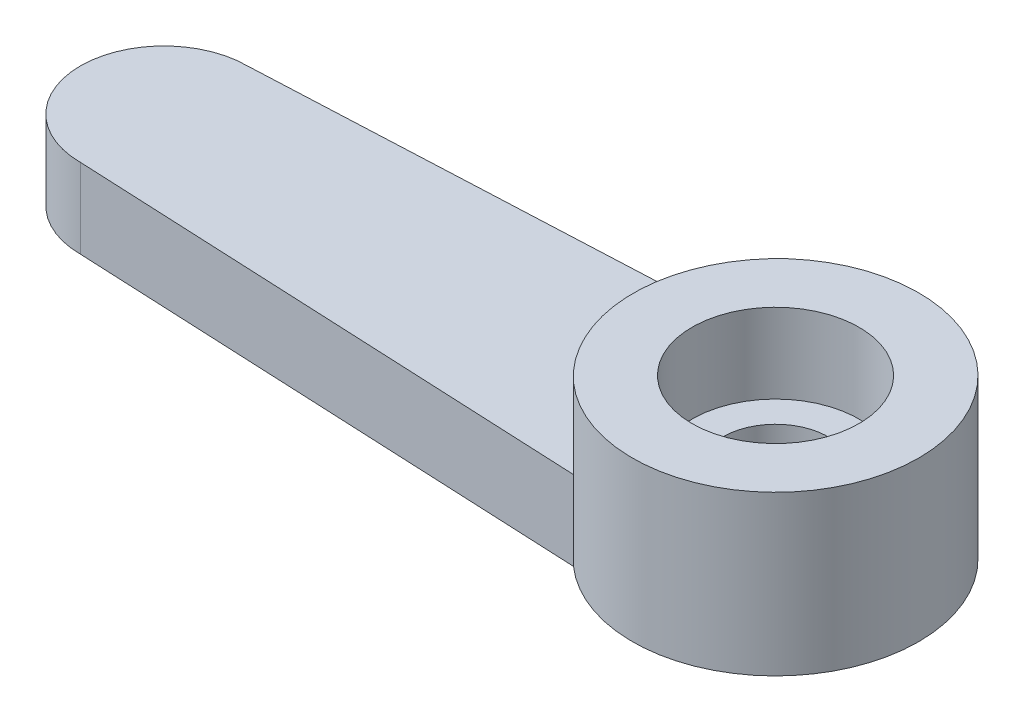
ISO-10303-21;
HEADER;
FILE_DESCRIPTION(('STEP AP214'),'2;1');
FILE_NAME('part.step','',(''),(''),'','','');
FILE_SCHEMA(('AUTOMOTIVE_DESIGN { 1 0 10303 214 1 1 1 1 }'));
ENDSEC;
DATA;
#1=APPLICATION_CONTEXT('core data for automotive mechanical design processes');
#2=APPLICATION_PROTOCOL_DEFINITION('international standard','automotive_design',2000,#1);
#3=PRODUCT_CONTEXT('',#1,'mechanical');
#4=PRODUCT('Part','Part','',(#3));
#5=PRODUCT_RELATED_PRODUCT_CATEGORY('part','',(#4));
#6=PRODUCT_DEFINITION_FORMATION('','',#4);
#7=PRODUCT_DEFINITION_CONTEXT('part definition',#1,'design');
#8=PRODUCT_DEFINITION('design','',#6,#7);
#9=PRODUCT_DEFINITION_SHAPE('','',#8);
#10=(LENGTH_UNIT() NAMED_UNIT(*) SI_UNIT(.MILLI.,.METRE.));
#11=(NAMED_UNIT(*) PLANE_ANGLE_UNIT() SI_UNIT($,.RADIAN.));
#12=(NAMED_UNIT(*) SI_UNIT($,.STERADIAN.) SOLID_ANGLE_UNIT());
#13=UNCERTAINTY_MEASURE_WITH_UNIT(LENGTH_MEASURE(1.E-05),#10,'distance_accuracy_value','');
#14=(GEOMETRIC_REPRESENTATION_CONTEXT(3) GLOBAL_UNCERTAINTY_ASSIGNED_CONTEXT((#13)) GLOBAL_UNIT_ASSIGNED_CONTEXT((#10,
#11,#12)) REPRESENTATION_CONTEXT('',''));
#15=CARTESIAN_POINT('',(0.,0.,0.));
#16=DIRECTION('',(0.,0.,1.));
#17=DIRECTION('',(1.,0.,0.));
#18=AXIS2_PLACEMENT_3D('',#15,#16,#17);
#19=CARTESIAN_POINT('',(-0.129412041950785,1.,2.80392757560034));
#20=DIRECTION('',(-0.0461047666084008,0.,0.998936609848686));
#21=DIRECTION('',(0.998936609848686,0.,0.0461047666084008));
#22=AXIS2_PLACEMENT_3D('',#19,#20,#21);
#23=PLANE('',#22);
#24=DIRECTION('',(-0.998936609848686,0.,-0.0461047666084008));
#25=VECTOR('',#24,1.);
#26=CARTESIAN_POINT('',(-0.129412041950785,-1.,2.80392757560034));
#27=LINE('',#26,#25);
#28=CARTESIAN_POINT('',(-2.38117617995813,-1.,2.7));
#29=VERTEX_POINT('',#28);
#30=CARTESIAN_POINT('',(-15.3811761799581,-1.,2.1));
#31=VERTEX_POINT('',#30);
#32=EDGE_CURVE('E107',#29,#31,#27,.T.);
#33=ORIENTED_EDGE('',*,*,#32,.F.);
#34=DIRECTION('',(0.,-1.,0.));
#35=VECTOR('',#34,1.);
#36=CARTESIAN_POINT('',(-2.38117617995813,1.,2.7));
#37=LINE('',#36,#35);
#38=CARTESIAN_POINT('',(-2.38117617995813,1.,2.7));
#39=VERTEX_POINT('',#38);
#40=EDGE_CURVE('E11',#39,#29,#37,.T.);
#41=ORIENTED_EDGE('',*,*,#40,.F.);
#42=DIRECTION('',(-0.998936609848686,0.,-0.0461047666084008));
#43=VECTOR('',#42,1.);
#44=CARTESIAN_POINT('',(-0.129412041950785,1.,2.80392757560034));
#45=LINE('',#44,#43);
#46=CARTESIAN_POINT('',(-15.3811761799581,1.,2.1));
#47=VERTEX_POINT('',#46);
#48=EDGE_CURVE('E115',#39,#47,#45,.T.);
#49=ORIENTED_EDGE('',*,*,#48,.T.);
#50=DIRECTION('',(0.,-1.,0.));
#51=VECTOR('',#50,1.);
#52=CARTESIAN_POINT('',(-15.3811761799581,1.,2.1));
#53=LINE('',#52,#51);
#54=EDGE_CURVE('E74',#47,#31,#53,.T.);
#55=ORIENTED_EDGE('',*,*,#54,.T.);
#56=EDGE_LOOP('',(#33,#41,#49,#55));
#57=FACE_BOUND('',#56,.T.);
#58=ADVANCED_FACE('F34',(#57),#23,.T.);
#59=CARTESIAN_POINT('',(0.,1.,0.));
#60=DIRECTION('',(0.,-1.,0.));
#61=DIRECTION('',(0.,0.,-1.));
#62=AXIS2_PLACEMENT_3D('',#59,#60,#61);
#63=CYLINDRICAL_SURFACE('',#62,3.6);
#64=CARTESIAN_POINT('',(0.,-1.,0.));
#65=DIRECTION('',(0.,1.,0.));
#66=DIRECTION('',(0.,0.,1.));
#67=AXIS2_PLACEMENT_3D('',#64,#65,#66);
#68=CIRCLE('',#67,3.6);
#69=CARTESIAN_POINT('',(-2.38117617995813,-1.,-2.7));
#70=VERTEX_POINT('',#69);
#71=EDGE_CURVE('E110',#29,#70,#68,.T.);
#72=ORIENTED_EDGE('',*,*,#71,.T.);
#73=DIRECTION('',(0.,-1.,0.));
#74=VECTOR('',#73,1.);
#75=CARTESIAN_POINT('',(-2.38117617995813,1.,-2.7));
#76=LINE('',#75,#74);
#77=CARTESIAN_POINT('',(-2.38117617995813,1.,-2.7));
#78=VERTEX_POINT('',#77);
#79=EDGE_CURVE('E43',#78,#70,#76,.T.);
#80=ORIENTED_EDGE('',*,*,#79,.F.);
#81=DIRECTION('',(0.,-1.,0.));
#82=VECTOR('',#81,1.);
#83=CARTESIAN_POINT('',(-2.38117617995813,3.,-2.7));
#84=LINE('',#83,#82);
#85=CARTESIAN_POINT('',(-2.38117617995813,3.,-2.7));
#86=VERTEX_POINT('',#85);
#87=EDGE_CURVE('E94',#86,#78,#84,.T.);
#88=ORIENTED_EDGE('',*,*,#87,.F.);
#89=CARTESIAN_POINT('',(0.,3.,0.));
#90=DIRECTION('',(0.,1.,0.));
#91=DIRECTION('',(0.,0.,1.));
#92=AXIS2_PLACEMENT_3D('',#89,#90,#91);
#93=CIRCLE('',#92,3.6);
#94=CARTESIAN_POINT('',(-2.38117617995813,3.,2.7));
#95=VERTEX_POINT('',#94);
#96=EDGE_CURVE('E99',#95,#86,#93,.T.);
#97=ORIENTED_EDGE('',*,*,#96,.F.);
#98=DIRECTION('',(0.,-1.,0.));
#99=VECTOR('',#98,1.);
#100=CARTESIAN_POINT('',(-2.38117617995813,3.,2.7));
#101=LINE('',#100,#99);
#102=EDGE_CURVE('E96',#95,#39,#101,.T.);
#103=ORIENTED_EDGE('',*,*,#102,.T.);
#104=ORIENTED_EDGE('',*,*,#40,.T.);
#105=EDGE_LOOP('',(#72,#80,#88,#97,#103,#104));
#106=FACE_BOUND('',#105,.T.);
#107=ADVANCED_FACE('F105',(#106),#63,.T.);
#108=CARTESIAN_POINT('',(-0.129412041950785,1.,-2.80392757560034));
#109=DIRECTION('',(0.046104766608401,0.,0.998936609848685));
#110=DIRECTION('',(0.998936609848686,0.,-0.046104766608401));
#111=AXIS2_PLACEMENT_3D('',#108,#109,#110);
#112=PLANE('',#111);
#113=DIRECTION('',(-0.998936609848686,0.,0.046104766608401));
#114=VECTOR('',#113,1.);
#115=CARTESIAN_POINT('',(-0.129412041950785,-1.,-2.80392757560034));
#116=LINE('',#115,#114);
#117=CARTESIAN_POINT('',(-15.3811761799581,-1.,-2.1));
#118=VERTEX_POINT('',#117);
#119=EDGE_CURVE('E68',#70,#118,#116,.T.);
#120=ORIENTED_EDGE('',*,*,#119,.T.);
#121=DIRECTION('',(0.,-1.,0.));
#122=VECTOR('',#121,1.);
#123=CARTESIAN_POINT('',(-15.3811761799581,1.,-2.1));
#124=LINE('',#123,#122);
#125=CARTESIAN_POINT('',(-15.3811761799581,1.,-2.1));
#126=VERTEX_POINT('',#125);
#127=EDGE_CURVE('E125',#126,#118,#124,.T.);
#128=ORIENTED_EDGE('',*,*,#127,.F.);
#129=DIRECTION('',(-0.998936609848686,0.,0.046104766608401));
#130=VECTOR('',#129,1.);
#131=CARTESIAN_POINT('',(-0.129412041950785,1.,-2.80392757560034));
#132=LINE('',#131,#130);
#133=EDGE_CURVE('E117',#78,#126,#132,.T.);
#134=ORIENTED_EDGE('',*,*,#133,.F.);
#135=ORIENTED_EDGE('',*,*,#79,.T.);
#136=EDGE_LOOP('',(#120,#128,#134,#135));
#137=FACE_BOUND('',#136,.T.);
#138=ADVANCED_FACE('F127',(#137),#112,.F.);
#139=CARTESIAN_POINT('',(-15.3811761799581,1.,0.));
#140=DIRECTION('',(0.,-1.,0.));
#141=DIRECTION('',(0.,0.,-1.));
#142=AXIS2_PLACEMENT_3D('',#139,#140,#141);
#143=CYLINDRICAL_SURFACE('',#142,2.1);
#144=CARTESIAN_POINT('',(-15.3811761799581,-1.,0.));
#145=DIRECTION('',(0.,1.,0.));
#146=DIRECTION('',(0.,0.,1.));
#147=AXIS2_PLACEMENT_3D('',#144,#145,#146);
#148=CIRCLE('',#147,2.1);
#149=EDGE_CURVE('E118',#118,#31,#148,.T.);
#150=ORIENTED_EDGE('',*,*,#149,.T.);
#151=ORIENTED_EDGE('',*,*,#54,.F.);
#152=CARTESIAN_POINT('',(-15.3811761799581,1.,0.));
#153=DIRECTION('',(0.,1.,0.));
#154=DIRECTION('',(0.,0.,1.));
#155=AXIS2_PLACEMENT_3D('',#152,#153,#154);
#156=CIRCLE('',#155,2.1);
#157=EDGE_CURVE('E51',#126,#47,#156,.T.);
#158=ORIENTED_EDGE('',*,*,#157,.F.);
#159=ORIENTED_EDGE('',*,*,#127,.T.);
#160=EDGE_LOOP('',(#150,#151,#158,#159));
#161=FACE_BOUND('',#160,.T.);
#162=ADVANCED_FACE('F133',(#161),#143,.T.);
#163=CARTESIAN_POINT('',(0.,1.,0.));
#164=DIRECTION('',(0.,1.,0.));
#165=DIRECTION('',(0.,0.,1.));
#166=AXIS2_PLACEMENT_3D('',#163,#164,#165);
#167=PLANE('',#166);
#168=CARTESIAN_POINT('',(0.062437946699352,1.,0.));
#169=DIRECTION('',(0.,1.,0.));
#170=DIRECTION('',(0.,0.,1.));
#171=AXIS2_PLACEMENT_3D('',#168,#169,#170);
#172=CIRCLE('',#171,3.64159992311072);
#173=EDGE_CURVE('E78',#78,#39,#172,.T.);
#174=ORIENTED_EDGE('',*,*,#173,.F.);
#175=ORIENTED_EDGE('',*,*,#133,.T.);
#176=ORIENTED_EDGE('',*,*,#157,.T.);
#177=ORIENTED_EDGE('',*,*,#48,.F.);
#178=EDGE_LOOP('',(#174,#175,#176,#177));
#179=FACE_BOUND('',#178,.T.);
#180=ADVANCED_FACE('F135',(#179),#167,.T.);
#181=CARTESIAN_POINT('',(0.,-1.,0.));
#182=DIRECTION('',(0.,1.,0.));
#183=DIRECTION('',(0.,0.,1.));
#184=AXIS2_PLACEMENT_3D('',#181,#182,#183);
#185=PLANE('',#184);
#186=CARTESIAN_POINT('',(0.,-1.,0.));
#187=DIRECTION('',(0.,1.,0.));
#188=DIRECTION('',(0.,0.,1.));
#189=AXIS2_PLACEMENT_3D('',#186,#187,#188);
#190=CIRCLE('',#189,1.325);
#191=CARTESIAN_POINT('',(0.,-1.,1.325));
#192=VERTEX_POINT('',#191);
#193=EDGE_CURVE('E251',#192,#192,#190,.T.);
#194=ORIENTED_EDGE('',*,*,#193,.T.);
#195=EDGE_LOOP('',(#194));
#196=FACE_BOUND('',#195,.T.);
#197=ORIENTED_EDGE('',*,*,#32,.T.);
#198=ORIENTED_EDGE('',*,*,#149,.F.);
#199=ORIENTED_EDGE('',*,*,#119,.F.);
#200=ORIENTED_EDGE('',*,*,#71,.F.);
#201=EDGE_LOOP('',(#197,#198,#199,#200));
#202=FACE_BOUND('',#201,.T.);
#203=ADVANCED_FACE('F131',(#196,#202),#185,.F.);
#204=CARTESIAN_POINT('',(0.,3.,0.));
#205=DIRECTION('',(0.,-1.,0.));
#206=DIRECTION('',(0.,0.,-1.));
#207=AXIS2_PLACEMENT_3D('',#204,#205,#206);
#208=CYLINDRICAL_SURFACE('',#207,2.1);
#209=CARTESIAN_POINT('',(0.,3.,0.));
#210=DIRECTION('',(0.,1.,0.));
#211=DIRECTION('',(0.,0.,1.));
#212=AXIS2_PLACEMENT_3D('',#209,#210,#211);
#213=CIRCLE('',#212,2.1);
#214=CARTESIAN_POINT('',(0.,3.,2.1));
#215=VERTEX_POINT('',#214);
#216=EDGE_CURVE('E103',#215,#215,#213,.T.);
#217=ORIENTED_EDGE('',*,*,#216,.T.);
#218=EDGE_LOOP('',(#217));
#219=FACE_BOUND('',#218,.T.);
#220=CARTESIAN_POINT('',(0.,1.,0.));
#221=DIRECTION('',(0.,1.,0.));
#222=DIRECTION('',(0.,0.,1.));
#223=AXIS2_PLACEMENT_3D('',#220,#221,#222);
#224=CIRCLE('',#223,2.1);
#225=CARTESIAN_POINT('',(0.,1.,2.1));
#226=VERTEX_POINT('',#225);
#227=EDGE_CURVE('E253',#226,#226,#224,.T.);
#228=ORIENTED_EDGE('',*,*,#227,.F.);
#229=EDGE_LOOP('',(#228));
#230=FACE_BOUND('',#229,.T.);
#231=ADVANCED_FACE('F143',(#219,#230),#208,.F.);
#232=CARTESIAN_POINT('',(0.062437946699352,3.,0.));
#233=DIRECTION('',(0.,-1.,0.));
#234=DIRECTION('',(0.,0.,-1.));
#235=AXIS2_PLACEMENT_3D('',#232,#233,#234);
#236=CYLINDRICAL_SURFACE('',#235,3.64159992311072);
#237=ORIENTED_EDGE('',*,*,#173,.T.);
#238=ORIENTED_EDGE('',*,*,#102,.F.);
#239=CARTESIAN_POINT('',(0.062437946699352,3.,0.));
#240=DIRECTION('',(0.,1.,0.));
#241=DIRECTION('',(0.,0.,1.));
#242=AXIS2_PLACEMENT_3D('',#239,#240,#241);
#243=CIRCLE('',#242,3.64159992311072);
#244=EDGE_CURVE('E90',#86,#95,#243,.T.);
#245=ORIENTED_EDGE('',*,*,#244,.F.);
#246=ORIENTED_EDGE('',*,*,#87,.T.);
#247=EDGE_LOOP('',(#237,#238,#245,#246));
#248=FACE_BOUND('',#247,.T.);
#249=ADVANCED_FACE('F92',(#248),#236,.T.);
#250=CARTESIAN_POINT('',(0.,3.,0.));
#251=DIRECTION('',(0.,1.,0.));
#252=DIRECTION('',(0.,0.,1.));
#253=AXIS2_PLACEMENT_3D('',#250,#251,#252);
#254=PLANE('',#253);
#255=ORIENTED_EDGE('',*,*,#216,.F.);
#256=EDGE_LOOP('',(#255));
#257=FACE_BOUND('',#256,.T.);
#258=ORIENTED_EDGE('',*,*,#96,.T.);
#259=ORIENTED_EDGE('',*,*,#244,.T.);
#260=EDGE_LOOP('',(#258,#259));
#261=FACE_BOUND('',#260,.T.);
#262=ADVANCED_FACE('F101',(#257,#261),#254,.T.);
#263=CARTESIAN_POINT('',(0.,1.,0.));
#264=DIRECTION('',(0.,1.,0.));
#265=DIRECTION('',(0.,0.,1.));
#266=AXIS2_PLACEMENT_3D('',#263,#264,#265);
#267=CIRCLE('',#266,1.325);
#268=CARTESIAN_POINT('',(0.,1.,1.325));
#269=VERTEX_POINT('',#268);
#270=EDGE_CURVE('E37',#269,#269,#267,.T.);
#271=ORIENTED_EDGE('',*,*,#270,.F.);
#272=EDGE_LOOP('',(#271));
#273=FACE_BOUND('',#272,.T.);
#274=ORIENTED_EDGE('',*,*,#227,.T.);
#275=EDGE_LOOP('',(#274));
#276=FACE_BOUND('',#275,.T.);
#277=ADVANCED_FACE('F138',(#273,#276),#167,.T.);
#278=CARTESIAN_POINT('',(0.,-1.,0.));
#279=DIRECTION('',(0.,1.,0.));
#280=DIRECTION('',(0.,0.,1.));
#281=AXIS2_PLACEMENT_3D('',#278,#279,#280);
#282=CYLINDRICAL_SURFACE('',#281,1.325);
#283=ORIENTED_EDGE('',*,*,#270,.T.);
#284=EDGE_LOOP('',(#283));
#285=FACE_BOUND('',#284,.T.);
#286=ORIENTED_EDGE('',*,*,#193,.F.);
#287=EDGE_LOOP('',(#286));
#288=FACE_BOUND('',#287,.T.);
#289=ADVANCED_FACE('F149',(#285,#288),#282,.F.);
#290=CLOSED_SHELL('',(#58,#107,#138,#162,#180,#203,#231,#249,#262,#277,#289));
#291=MANIFOLD_SOLID_BREP('B2',#290);
#292=ADVANCED_BREP_SHAPE_REPRESENTATION('',(#18,#291),#14);
#293=SHAPE_DEFINITION_REPRESENTATION(#9,#292);
ENDSEC;
END-ISO-10303-21;
